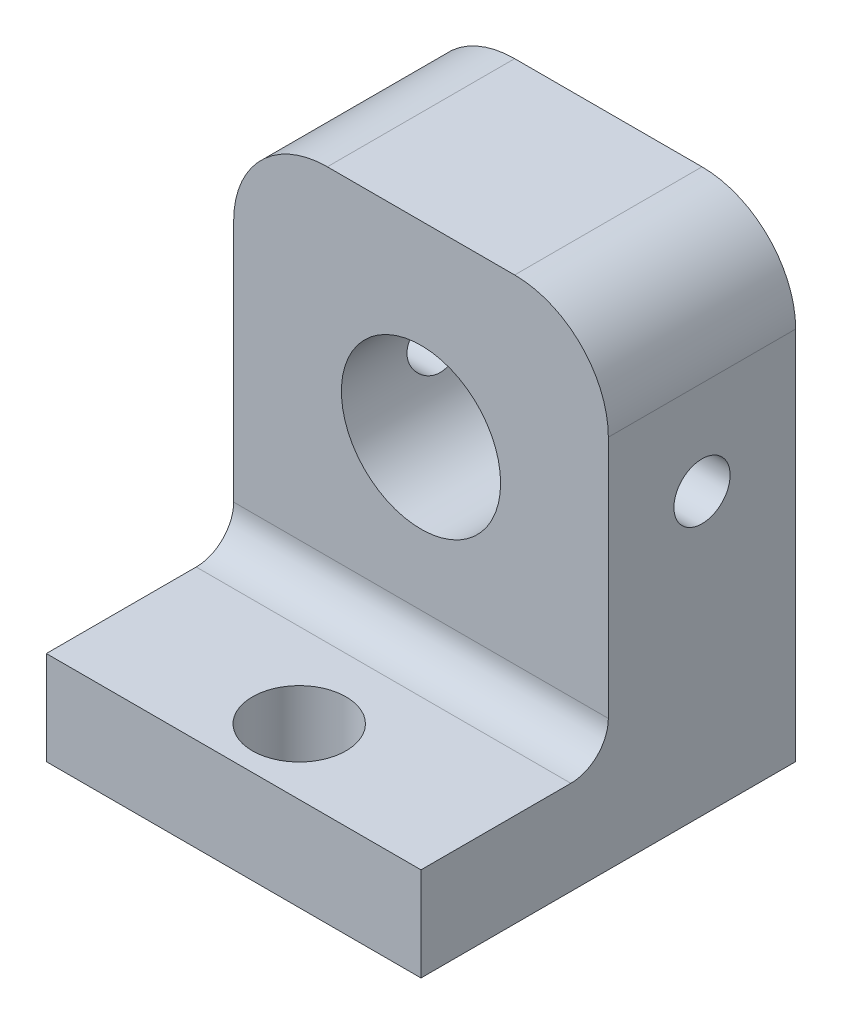
ISO-10303-21;
HEADER;
FILE_DESCRIPTION(('STEP AP214'),'2;1');
FILE_NAME('part.step','',(''),(''),'','','');
FILE_SCHEMA(('AUTOMOTIVE_DESIGN { 1 0 10303 214 1 1 1 1 }'));
ENDSEC;
DATA;
#1=APPLICATION_CONTEXT('core data for automotive mechanical design processes');
#2=APPLICATION_PROTOCOL_DEFINITION('international standard','automotive_design',2000,#1);
#3=PRODUCT_CONTEXT('',#1,'mechanical');
#4=PRODUCT('Part','Part','',(#3));
#5=PRODUCT_RELATED_PRODUCT_CATEGORY('part','',(#4));
#6=PRODUCT_DEFINITION_FORMATION('','',#4);
#7=PRODUCT_DEFINITION_CONTEXT('part definition',#1,'design');
#8=PRODUCT_DEFINITION('design','',#6,#7);
#9=PRODUCT_DEFINITION_SHAPE('','',#8);
#10=(LENGTH_UNIT() NAMED_UNIT(*) SI_UNIT(.MILLI.,.METRE.));
#11=(NAMED_UNIT(*) PLANE_ANGLE_UNIT() SI_UNIT($,.RADIAN.));
#12=(NAMED_UNIT(*) SI_UNIT($,.STERADIAN.) SOLID_ANGLE_UNIT());
#13=UNCERTAINTY_MEASURE_WITH_UNIT(LENGTH_MEASURE(1.E-05),#10,'distance_accuracy_value','');
#14=(GEOMETRIC_REPRESENTATION_CONTEXT(3) GLOBAL_UNCERTAINTY_ASSIGNED_CONTEXT((#13)) GLOBAL_UNIT_ASSIGNED_CONTEXT((#10,
#11,#12)) REPRESENTATION_CONTEXT('',''));
#15=CARTESIAN_POINT('',(0.,0.,0.));
#16=DIRECTION('',(0.,0.,1.));
#17=DIRECTION('',(1.,0.,0.));
#18=AXIS2_PLACEMENT_3D('',#15,#16,#17);
#19=CARTESIAN_POINT('',(0.,5.,0.));
#20=DIRECTION('',(0.,1.,0.));
#21=DIRECTION('',(0.,0.,1.));
#22=AXIS2_PLACEMENT_3D('',#19,#20,#21);
#23=PLANE('',#22);
#24=CARTESIAN_POINT('',(0.,5.,6.50000000000001));
#25=DIRECTION('',(0.,1.,0.));
#26=DIRECTION('',(0.,0.,1.));
#27=AXIS2_PLACEMENT_3D('',#24,#25,#26);
#28=CIRCLE('',#27,2.5);
#29=CARTESIAN_POINT('',(0.,5.,9.00000000000001));
#30=VERTEX_POINT('',#29);
#31=EDGE_CURVE('E124',#30,#30,#28,.T.);
#32=ORIENTED_EDGE('',*,*,#31,.F.);
#33=EDGE_LOOP('',(#32));
#34=FACE_BOUND('',#33,.T.);
#35=DIRECTION('',(0.,0.,-1.));
#36=VECTOR('',#35,1.);
#37=CARTESIAN_POINT('',(10.,5.,0.));
#38=LINE('',#37,#36);
#39=CARTESIAN_POINT('',(10.,5.,10.));
#40=VERTEX_POINT('',#39);
#41=CARTESIAN_POINT('',(10.,5.,2.));
#42=VERTEX_POINT('',#41);
#43=EDGE_CURVE('E128',#40,#42,#38,.T.);
#44=ORIENTED_EDGE('',*,*,#43,.T.);
#45=DIRECTION('',(-1.,0.,0.));
#46=VECTOR('',#45,1.);
#47=CARTESIAN_POINT('',(0.,5.,2.00000000000001));
#48=LINE('',#47,#46);
#49=CARTESIAN_POINT('',(-10.,5.,2.00000000000001));
#50=VERTEX_POINT('',#49);
#51=EDGE_CURVE('E123',#42,#50,#48,.T.);
#52=ORIENTED_EDGE('',*,*,#51,.T.);
#53=DIRECTION('',(0.,0.,-1.));
#54=VECTOR('',#53,1.);
#55=CARTESIAN_POINT('',(-10.,5.,0.));
#56=LINE('',#55,#54);
#57=CARTESIAN_POINT('',(-10.,5.,10.));
#58=VERTEX_POINT('',#57);
#59=EDGE_CURVE('E107',#58,#50,#56,.T.);
#60=ORIENTED_EDGE('',*,*,#59,.F.);
#61=DIRECTION('',(-1.,0.,0.));
#62=VECTOR('',#61,1.);
#63=CARTESIAN_POINT('',(0.,5.,10.));
#64=LINE('',#63,#62);
#65=EDGE_CURVE('E121',#40,#58,#64,.T.);
#66=ORIENTED_EDGE('',*,*,#65,.F.);
#67=EDGE_LOOP('',(#44,#52,#60,#66));
#68=FACE_BOUND('',#67,.T.);
#69=ADVANCED_FACE('F35',(#34,#68),#23,.T.);
#70=CARTESIAN_POINT('',(-10.,5.,0.));
#71=DIRECTION('',(-1.,0.,0.));
#72=DIRECTION('',(0.,0.,1.));
#73=AXIS2_PLACEMENT_3D('',#70,#71,#72);
#74=PLANE('',#73);
#75=CARTESIAN_POINT('',(-9.99999999999999,15.,-5.));
#76=DIRECTION('',(-1.,0.,0.));
#77=DIRECTION('',(0.,0.,1.));
#78=AXIS2_PLACEMENT_3D('',#75,#76,#77);
#79=CIRCLE('',#78,1.5);
#80=CARTESIAN_POINT('',(-9.99999999999999,15.,-3.5));
#81=VERTEX_POINT('',#80);
#82=EDGE_CURVE('E260',#81,#81,#79,.T.);
#83=ORIENTED_EDGE('',*,*,#82,.F.);
#84=EDGE_LOOP('',(#83));
#85=FACE_BOUND('',#84,.T.);
#86=DIRECTION('',(0.,-1.,0.));
#87=VECTOR('',#86,1.);
#88=CARTESIAN_POINT('',(-10.,25.,0.));
#89=LINE('',#88,#87);
#90=CARTESIAN_POINT('',(-10.,20.,0.));
#91=VERTEX_POINT('',#90);
#92=CARTESIAN_POINT('',(-10.,7.,0.));
#93=VERTEX_POINT('',#92);
#94=EDGE_CURVE('E137',#91,#93,#89,.T.);
#95=ORIENTED_EDGE('',*,*,#94,.F.);
#96=DIRECTION('',(0.,0.,-1.));
#97=VECTOR('',#96,1.);
#98=CARTESIAN_POINT('',(-10.,20.,0.));
#99=LINE('',#98,#97);
#100=CARTESIAN_POINT('',(-10.,20.,-9.99999999999999));
#101=VERTEX_POINT('',#100);
#102=EDGE_CURVE('E114',#91,#101,#99,.T.);
#103=ORIENTED_EDGE('',*,*,#102,.T.);
#104=DIRECTION('',(0.,-1.,0.));
#105=VECTOR('',#104,1.);
#106=CARTESIAN_POINT('',(-10.,5.,-9.99999999999999));
#107=LINE('',#106,#105);
#108=CARTESIAN_POINT('',(-10.,0.,-9.99999999999999));
#109=VERTEX_POINT('',#108);
#110=EDGE_CURVE('E130',#101,#109,#107,.T.);
#111=ORIENTED_EDGE('',*,*,#110,.T.);
#112=DIRECTION('',(0.,0.,-1.));
#113=VECTOR('',#112,1.);
#114=CARTESIAN_POINT('',(-10.,0.,0.));
#115=LINE('',#114,#113);
#116=CARTESIAN_POINT('',(-10.,0.,10.));
#117=VERTEX_POINT('',#116);
#118=EDGE_CURVE('E109',#117,#109,#115,.T.);
#119=ORIENTED_EDGE('',*,*,#118,.F.);
#120=DIRECTION('',(0.,-1.,0.));
#121=VECTOR('',#120,1.);
#122=CARTESIAN_POINT('',(-10.,5.,10.));
#123=LINE('',#122,#121);
#124=EDGE_CURVE('E104',#58,#117,#123,.T.);
#125=ORIENTED_EDGE('',*,*,#124,.F.);
#126=ORIENTED_EDGE('',*,*,#59,.T.);
#127=CARTESIAN_POINT('',(-10.,7.,2.00000000000001));
#128=DIRECTION('',(-1.,0.,0.));
#129=DIRECTION('',(0.,0.,1.));
#130=AXIS2_PLACEMENT_3D('',#127,#128,#129);
#131=CIRCLE('',#130,2.);
#132=EDGE_CURVE('E43',#50,#93,#131,.F.);
#133=ORIENTED_EDGE('',*,*,#132,.T.);
#134=EDGE_LOOP('',(#95,#103,#111,#119,#125,#126,#133));
#135=FACE_BOUND('',#134,.T.);
#136=ADVANCED_FACE('F106',(#85,#135),#74,.T.);
#137=CARTESIAN_POINT('',(0.,5.,10.));
#138=DIRECTION('',(0.,0.,1.));
#139=DIRECTION('',(1.,0.,0.));
#140=AXIS2_PLACEMENT_3D('',#137,#138,#139);
#141=PLANE('',#140);
#142=DIRECTION('',(-1.,0.,0.));
#143=VECTOR('',#142,1.);
#144=CARTESIAN_POINT('',(0.,0.,10.));
#145=LINE('',#144,#143);
#146=CARTESIAN_POINT('',(10.,0.,10.));
#147=VERTEX_POINT('',#146);
#148=EDGE_CURVE('E139',#147,#117,#145,.T.);
#149=ORIENTED_EDGE('',*,*,#148,.F.);
#150=DIRECTION('',(0.,-1.,0.));
#151=VECTOR('',#150,1.);
#152=CARTESIAN_POINT('',(10.,5.,10.));
#153=LINE('',#152,#151);
#154=EDGE_CURVE('E115',#40,#147,#153,.T.);
#155=ORIENTED_EDGE('',*,*,#154,.F.);
#156=ORIENTED_EDGE('',*,*,#65,.T.);
#157=ORIENTED_EDGE('',*,*,#124,.T.);
#158=EDGE_LOOP('',(#149,#155,#156,#157));
#159=FACE_BOUND('',#158,.T.);
#160=ADVANCED_FACE('F126',(#159),#141,.T.);
#161=CARTESIAN_POINT('',(10.,5.,0.));
#162=DIRECTION('',(-1.,0.,0.));
#163=DIRECTION('',(0.,0.,1.));
#164=AXIS2_PLACEMENT_3D('',#161,#162,#163);
#165=PLANE('',#164);
#166=CARTESIAN_POINT('',(10.,15.,-5.));
#167=DIRECTION('',(1.,0.,0.));
#168=DIRECTION('',(0.,0.,-1.));
#169=AXIS2_PLACEMENT_3D('',#166,#167,#168);
#170=CIRCLE('',#169,1.5);
#171=CARTESIAN_POINT('',(10.,15.,-6.5));
#172=VERTEX_POINT('',#171);
#173=EDGE_CURVE('E160',#172,#172,#170,.T.);
#174=ORIENTED_EDGE('',*,*,#173,.F.);
#175=EDGE_LOOP('',(#174));
#176=FACE_BOUND('',#175,.T.);
#177=DIRECTION('',(0.,-1.,0.));
#178=VECTOR('',#177,1.);
#179=CARTESIAN_POINT('',(10.,5.,-10.));
#180=LINE('',#179,#178);
#181=CARTESIAN_POINT('',(10.,20.,-10.));
#182=VERTEX_POINT('',#181);
#183=CARTESIAN_POINT('',(10.,0.,-10.));
#184=VERTEX_POINT('',#183);
#185=EDGE_CURVE('E148',#182,#184,#180,.T.);
#186=ORIENTED_EDGE('',*,*,#185,.F.);
#187=DIRECTION('',(0.,0.,-1.));
#188=VECTOR('',#187,1.);
#189=CARTESIAN_POINT('',(10.,20.,0.));
#190=LINE('',#189,#188);
#191=CARTESIAN_POINT('',(10.,20.,0.));
#192=VERTEX_POINT('',#191);
#193=EDGE_CURVE('E224',#182,#192,#190,.F.);
#194=ORIENTED_EDGE('',*,*,#193,.T.);
#195=DIRECTION('',(0.,-1.,0.));
#196=VECTOR('',#195,1.);
#197=CARTESIAN_POINT('',(10.,25.,0.));
#198=LINE('',#197,#196);
#199=CARTESIAN_POINT('',(10.,7.,0.));
#200=VERTEX_POINT('',#199);
#201=EDGE_CURVE('E240',#192,#200,#198,.T.);
#202=ORIENTED_EDGE('',*,*,#201,.T.);
#203=CARTESIAN_POINT('',(10.,7.,2.));
#204=DIRECTION('',(-1.,0.,0.));
#205=DIRECTION('',(0.,0.,1.));
#206=AXIS2_PLACEMENT_3D('',#203,#204,#205);
#207=CIRCLE('',#206,2.);
#208=EDGE_CURVE('E11',#200,#42,#207,.T.);
#209=ORIENTED_EDGE('',*,*,#208,.T.);
#210=ORIENTED_EDGE('',*,*,#43,.F.);
#211=ORIENTED_EDGE('',*,*,#154,.T.);
#212=DIRECTION('',(0.,0.,-1.));
#213=VECTOR('',#212,1.);
#214=CARTESIAN_POINT('',(10.,0.,0.));
#215=LINE('',#214,#213);
#216=EDGE_CURVE('E141',#147,#184,#215,.T.);
#217=ORIENTED_EDGE('',*,*,#216,.T.);
#218=EDGE_LOOP('',(#186,#194,#202,#209,#210,#211,#217));
#219=FACE_BOUND('',#218,.T.);
#220=ADVANCED_FACE('F206',(#176,#219),#165,.F.);
#221=CARTESIAN_POINT('',(0.,5.,6.50000000000001));
#222=DIRECTION('',(0.,-1.,0.));
#223=DIRECTION('',(0.,0.,-1.));
#224=AXIS2_PLACEMENT_3D('',#221,#222,#223);
#225=CYLINDRICAL_SURFACE('',#224,2.5);
#226=ORIENTED_EDGE('',*,*,#31,.T.);
#227=EDGE_LOOP('',(#226));
#228=FACE_BOUND('',#227,.T.);
#229=CARTESIAN_POINT('',(0.,0.,6.50000000000001));
#230=DIRECTION('',(0.,1.,0.));
#231=DIRECTION('',(0.,0.,1.));
#232=AXIS2_PLACEMENT_3D('',#229,#230,#231);
#233=CIRCLE('',#232,2.5);
#234=CARTESIAN_POINT('',(0.,0.,9.00000000000001));
#235=VERTEX_POINT('',#234);
#236=EDGE_CURVE('E134',#235,#235,#233,.T.);
#237=ORIENTED_EDGE('',*,*,#236,.F.);
#238=EDGE_LOOP('',(#237));
#239=FACE_BOUND('',#238,.T.);
#240=ADVANCED_FACE('F204',(#228,#239),#225,.F.);
#241=CARTESIAN_POINT('',(0.,5.,-9.99999999999999));
#242=DIRECTION('',(0.,0.,1.));
#243=DIRECTION('',(1.,0.,0.));
#244=AXIS2_PLACEMENT_3D('',#241,#242,#243);
#245=PLANE('',#244);
#246=CARTESIAN_POINT('',(0.,15.,-9.99999999999999));
#247=DIRECTION('',(0.,0.,1.));
#248=DIRECTION('',(1.,0.,0.));
#249=AXIS2_PLACEMENT_3D('',#246,#247,#248);
#250=CIRCLE('',#249,4.25);
#251=CARTESIAN_POINT('',(4.25,15.,-9.99999999999999));
#252=VERTEX_POINT('',#251);
#253=EDGE_CURVE('E254',#252,#252,#250,.T.);
#254=ORIENTED_EDGE('',*,*,#253,.T.);
#255=EDGE_LOOP('',(#254));
#256=FACE_BOUND('',#255,.T.);
#257=ORIENTED_EDGE('',*,*,#110,.F.);
#258=CARTESIAN_POINT('',(-5.,20.,-9.99999999999999));
#259=DIRECTION('',(0.,0.,1.));
#260=DIRECTION('',(1.,0.,0.));
#261=AXIS2_PLACEMENT_3D('',#258,#259,#260);
#262=CIRCLE('',#261,5.);
#263=CARTESIAN_POINT('',(-5.,25.,-9.99999999999999));
#264=VERTEX_POINT('',#263);
#265=EDGE_CURVE('E279',#101,#264,#262,.F.);
#266=ORIENTED_EDGE('',*,*,#265,.T.);
#267=DIRECTION('',(-1.,0.,0.));
#268=VECTOR('',#267,1.);
#269=CARTESIAN_POINT('',(0.,25.,-9.99999999999999));
#270=LINE('',#269,#268);
#271=CARTESIAN_POINT('',(5.,25.,-10.));
#272=VERTEX_POINT('',#271);
#273=EDGE_CURVE('E242',#272,#264,#270,.T.);
#274=ORIENTED_EDGE('',*,*,#273,.F.);
#275=CARTESIAN_POINT('',(5.,20.,-10.));
#276=DIRECTION('',(0.,0.,1.));
#277=DIRECTION('',(1.,0.,0.));
#278=AXIS2_PLACEMENT_3D('',#275,#276,#277);
#279=CIRCLE('',#278,5.);
#280=EDGE_CURVE('E285',#272,#182,#279,.F.);
#281=ORIENTED_EDGE('',*,*,#280,.T.);
#282=ORIENTED_EDGE('',*,*,#185,.T.);
#283=DIRECTION('',(-1.,0.,0.));
#284=VECTOR('',#283,1.);
#285=CARTESIAN_POINT('',(0.,0.,-9.99999999999999));
#286=LINE('',#285,#284);
#287=EDGE_CURVE('E144',#184,#109,#286,.T.);
#288=ORIENTED_EDGE('',*,*,#287,.T.);
#289=EDGE_LOOP('',(#257,#266,#274,#281,#282,#288));
#290=FACE_BOUND('',#289,.T.);
#291=ADVANCED_FACE('F200',(#256,#290),#245,.F.);
#292=CARTESIAN_POINT('',(0.,0.,0.));
#293=DIRECTION('',(0.,1.,0.));
#294=DIRECTION('',(0.,0.,1.));
#295=AXIS2_PLACEMENT_3D('',#292,#293,#294);
#296=PLANE('',#295);
#297=ORIENTED_EDGE('',*,*,#287,.F.);
#298=ORIENTED_EDGE('',*,*,#216,.F.);
#299=ORIENTED_EDGE('',*,*,#148,.T.);
#300=ORIENTED_EDGE('',*,*,#118,.T.);
#301=EDGE_LOOP('',(#297,#298,#299,#300));
#302=FACE_BOUND('',#301,.T.);
#303=ORIENTED_EDGE('',*,*,#236,.T.);
#304=EDGE_LOOP('',(#303));
#305=FACE_BOUND('',#304,.T.);
#306=ADVANCED_FACE('F197',(#302,#305),#296,.F.);
#307=CARTESIAN_POINT('',(0.,25.,0.));
#308=DIRECTION('',(0.,0.,-1.));
#309=DIRECTION('',(-1.,0.,0.));
#310=AXIS2_PLACEMENT_3D('',#307,#308,#309);
#311=PLANE('',#310);
#312=CARTESIAN_POINT('',(0.,15.,0.));
#313=DIRECTION('',(0.,0.,1.));
#314=DIRECTION('',(1.,0.,0.));
#315=AXIS2_PLACEMENT_3D('',#312,#313,#314);
#316=CIRCLE('',#315,4.25);
#317=CARTESIAN_POINT('',(4.25,15.,0.));
#318=VERTEX_POINT('',#317);
#319=EDGE_CURVE('E257',#318,#318,#316,.T.);
#320=ORIENTED_EDGE('',*,*,#319,.F.);
#321=EDGE_LOOP('',(#320));
#322=FACE_BOUND('',#321,.T.);
#323=ORIENTED_EDGE('',*,*,#94,.T.);
#324=DIRECTION('',(-1.,0.,0.));
#325=VECTOR('',#324,1.);
#326=CARTESIAN_POINT('',(0.,7.,0.));
#327=LINE('',#326,#325);
#328=EDGE_CURVE('E50',#93,#200,#327,.F.);
#329=ORIENTED_EDGE('',*,*,#328,.T.);
#330=ORIENTED_EDGE('',*,*,#201,.F.);
#331=CARTESIAN_POINT('',(5.,20.,0.));
#332=DIRECTION('',(0.,0.,-1.));
#333=DIRECTION('',(-1.,0.,0.));
#334=AXIS2_PLACEMENT_3D('',#331,#332,#333);
#335=CIRCLE('',#334,5.);
#336=CARTESIAN_POINT('',(5.,25.,0.));
#337=VERTEX_POINT('',#336);
#338=EDGE_CURVE('E223',#192,#337,#335,.F.);
#339=ORIENTED_EDGE('',*,*,#338,.T.);
#340=DIRECTION('',(1.,0.,0.));
#341=VECTOR('',#340,1.);
#342=CARTESIAN_POINT('',(0.,25.,0.));
#343=LINE('',#342,#341);
#344=CARTESIAN_POINT('',(-5.,25.,0.));
#345=VERTEX_POINT('',#344);
#346=EDGE_CURVE('E246',#345,#337,#343,.T.);
#347=ORIENTED_EDGE('',*,*,#346,.F.);
#348=CARTESIAN_POINT('',(-5.,20.,0.));
#349=DIRECTION('',(0.,0.,-1.));
#350=DIRECTION('',(-1.,0.,0.));
#351=AXIS2_PLACEMENT_3D('',#348,#349,#350);
#352=CIRCLE('',#351,5.);
#353=EDGE_CURVE('E229',#345,#91,#352,.F.);
#354=ORIENTED_EDGE('',*,*,#353,.T.);
#355=EDGE_LOOP('',(#323,#329,#330,#339,#347,#354));
#356=FACE_BOUND('',#355,.T.);
#357=ADVANCED_FACE('F196',(#322,#356),#311,.F.);
#358=CARTESIAN_POINT('',(0.,25.,0.));
#359=DIRECTION('',(0.,1.,0.));
#360=DIRECTION('',(0.,0.,1.));
#361=AXIS2_PLACEMENT_3D('',#358,#359,#360);
#362=PLANE('',#361);
#363=ORIENTED_EDGE('',*,*,#273,.T.);
#364=DIRECTION('',(0.,0.,-1.));
#365=VECTOR('',#364,1.);
#366=CARTESIAN_POINT('',(-5.,25.,0.));
#367=LINE('',#366,#365);
#368=EDGE_CURVE('E230',#264,#345,#367,.F.);
#369=ORIENTED_EDGE('',*,*,#368,.T.);
#370=ORIENTED_EDGE('',*,*,#346,.T.);
#371=DIRECTION('',(0.,0.,-1.));
#372=VECTOR('',#371,1.);
#373=CARTESIAN_POINT('',(5.,25.,-10.));
#374=LINE('',#373,#372);
#375=EDGE_CURVE('E226',#337,#272,#374,.T.);
#376=ORIENTED_EDGE('',*,*,#375,.T.);
#377=EDGE_LOOP('',(#363,#369,#370,#376));
#378=FACE_BOUND('',#377,.T.);
#379=ADVANCED_FACE('F270',(#378),#362,.T.);
#380=CARTESIAN_POINT('',(0.,15.,-88.));
#381=DIRECTION('',(0.,0.,1.));
#382=DIRECTION('',(1.,0.,0.));
#383=AXIS2_PLACEMENT_3D('',#380,#381,#382);
#384=CYLINDRICAL_SURFACE('',#383,4.25);
#385=CARTESIAN_POINT('',(4.25,15.,-6.49999999999999));
#386=CARTESIAN_POINT('',(4.2500010209157,15.0815655083667,-6.50000143944535));
#387=CARTESIAN_POINT('',(4.24763079702054,15.1631207396293,-6.49332577446252));
#388=CARTESIAN_POINT('',(4.23841044575562,15.323812547744,-6.46689313191938));
#389=CARTESIAN_POINT('',(4.2315603770681,15.4029491562638,-6.44713632571116));
#390=CARTESIAN_POINT('',(4.2141205688639,15.5564638689952,-6.39531449292629));
#391=CARTESIAN_POINT('',(4.20353753046498,15.6308502197219,-6.36327151255959));
#392=CARTESIAN_POINT('',(4.17969988413846,15.7731905397872,-6.28789229743801));
#393=CARTESIAN_POINT('',(4.16644465546129,15.8411430091355,-6.24455343796499));
#394=CARTESIAN_POINT('',(4.13807832016637,15.9712872677489,-6.14607496486553));
#395=CARTESIAN_POINT('',(4.12291896125755,16.0331994160495,-6.09057979490176));
#396=CARTESIAN_POINT('',(4.09270521060981,16.1470573280697,-5.97011924449603));
#397=CARTESIAN_POINT('',(4.07765084685791,16.1990005255228,-5.90515143310439));
#398=CARTESIAN_POINT('',(4.04880698686655,16.2931242772022,-5.76497468097734));
#399=CARTESIAN_POINT('',(4.03507546976457,16.3349270075802,-5.68949894382118));
#400=CARTESIAN_POINT('',(4.01117354628646,16.4051234982238,-5.53202601709707));
#401=CARTESIAN_POINT('',(4.0010019017598,16.4335219218092,-5.45003110714739));
#402=CARTESIAN_POINT('',(3.9858829929351,16.4750292626899,-5.28504742524595));
#403=CARTESIAN_POINT('',(3.98075571416019,16.4886668941198,-5.20220868575249));
#404=CARTESIAN_POINT('',(3.97577601517782,16.5019188071328,-5.03527219196318));
#405=CARTESIAN_POINT('',(3.97592172401636,16.5015380626955,-4.95117489481368));
#406=CARTESIAN_POINT('',(3.98131493672348,16.487171647383,-4.78876227923844));
#407=CARTESIAN_POINT('',(3.98629652758993,16.4738950639563,-4.71037382789625));
#408=CARTESIAN_POINT('',(4.00036197260984,16.4352776734831,-4.55701851152451));
#409=CARTESIAN_POINT('',(4.00944637437166,16.4099352559671,-4.48205210471155));
#410=CARTESIAN_POINT('',(4.03086961718048,16.3474763669417,-4.33613441236969));
#411=CARTESIAN_POINT('',(4.04326253509493,16.3101619580702,-4.26527613813148));
#412=CARTESIAN_POINT('',(4.06988590478,16.2249558676346,-4.13061114374695));
#413=CARTESIAN_POINT('',(4.0841169363794,16.1770608450389,-4.06680666054036));
#414=CARTESIAN_POINT('',(4.11383840224644,16.0687213955098,-3.94410211573714));
#415=CARTESIAN_POINT('',(4.12935360736949,16.0077033472796,-3.88571339048548));
#416=CARTESIAN_POINT('',(4.15916674047781,15.8765552448598,-3.77985529588603));
#417=CARTESIAN_POINT('',(4.17346452155981,15.8064240935884,-3.73238724313357));
#418=CARTESIAN_POINT('',(4.19946112552831,15.6578561927707,-3.64923840720676));
#419=CARTESIAN_POINT('',(4.2111258238281,15.5793279072425,-3.61370976381837));
#420=CARTESIAN_POINT('',(4.23029207791539,15.4168968768017,-3.55653120313297));
#421=CARTESIAN_POINT('',(4.23779526295093,15.3329962495513,-3.53487585387367));
#422=CARTESIAN_POINT('',(4.24751560494482,15.1665195024488,-3.50699956687643));
#423=CARTESIAN_POINT('',(4.24996881305308,15.084072537849,-3.50008881463701));
#424=CARTESIAN_POINT('',(4.25003056815402,14.9191710934224,-3.49991293869687));
#425=CARTESIAN_POINT('',(4.24764004701629,14.8367166180923,-3.50664519026226));
#426=CARTESIAN_POINT('',(4.23843896402726,14.6770018497132,-3.53302755425178));
#427=CARTESIAN_POINT('',(4.2317778102469,14.5996599961407,-3.55224129201919));
#428=CARTESIAN_POINT('',(4.21485447662064,14.449338945805,-3.60248244929079));
#429=CARTESIAN_POINT('',(4.2045918300867,14.3763603158715,-3.63351139987629));
#430=CARTESIAN_POINT('',(4.18113823249899,14.2345624874119,-3.70745316384237));
#431=CARTESIAN_POINT('',(4.16787357328707,14.1659161338648,-3.75067337085768));
#432=CARTESIAN_POINT('',(4.13990428237041,14.0366336982178,-3.84741636920994));
#433=CARTESIAN_POINT('',(4.12519916677669,13.9760003240774,-3.90094262850451));
#434=CARTESIAN_POINT('',(4.09504516039956,13.8612254525735,-4.02001323560803));
#435=CARTESIAN_POINT('',(4.0795967484747,13.8075754788489,-4.08603269288312));
#436=CARTESIAN_POINT('',(4.050451474741,13.7120382833121,-4.22645905200557));
#437=CARTESIAN_POINT('',(4.03675468400403,13.6701515387094,-4.30086629395622));
#438=CARTESIAN_POINT('',(4.01276844860528,13.5994313969781,-4.4562247580116));
#439=CARTESIAN_POINT('',(4.00248050035801,13.5706037304932,-4.53717883469946));
#440=CARTESIAN_POINT('',(3.98669663677319,13.5271473724767,-4.70324802962323));
#441=CARTESIAN_POINT('',(3.98119820675466,13.5125112293929,-4.78836093949024));
#442=CARTESIAN_POINT('',(3.97592446271836,13.498475672914,-4.95507571865943));
#443=CARTESIAN_POINT('',(3.97583895136912,13.4982504090341,-5.03659893285742));
#444=CARTESIAN_POINT('',(3.98062071938137,13.5109721823524,-5.19845529984475));
#445=CARTESIAN_POINT('',(3.98548763101594,13.5239182415546,-5.2787885405426));
#446=CARTESIAN_POINT('',(3.99938188223679,13.5620022319411,-5.43405368378034));
#447=CARTESIAN_POINT('',(4.00830695183632,13.5868412199511,-5.5090688109465));
#448=CARTESIAN_POINT('',(4.02926366752764,13.6477549144838,-5.65391934979862));
#449=CARTESIAN_POINT('',(4.04129605143985,13.6838322899406,-5.72375352621022));
#450=CARTESIAN_POINT('',(4.06782868650947,13.7682077994862,-5.85988604831732));
#451=CARTESIAN_POINT('',(4.08241946444022,13.8170080196561,-5.92585539643861));
#452=CARTESIAN_POINT('',(4.11207835247002,13.9246285183541,-6.04893433302365));
#453=CARTESIAN_POINT('',(4.12714660409913,13.9834517909086,-6.10604126439113));
#454=CARTESIAN_POINT('',(4.15688911811243,14.1126679135724,-6.21241802120559));
#455=CARTESIAN_POINT('',(4.17151395756386,14.1834664587041,-6.26121080900395));
#456=CARTESIAN_POINT('',(4.19797905376782,14.3327590518131,-6.34616589279597));
#457=CARTESIAN_POINT('',(4.20981961499931,14.4112522569978,-6.38232957007517));
#458=CARTESIAN_POINT('',(4.22931721412351,14.573380915312,-6.4406175423347));
#459=CARTESIAN_POINT('',(4.23699362671968,14.6569905039307,-6.46280693508599));
#460=CARTESIAN_POINT('',(4.24733355773892,14.8270712862147,-6.49249470234612));
#461=CARTESIAN_POINT('',(4.24999891784007,14.9135414166702,-6.49999847420301));
#462=CARTESIAN_POINT('',(4.25,15.,-6.49999999999999));
#463=B_SPLINE_CURVE_WITH_KNOTS('',3,(#385,#386,#387,#388,#389,#390,#391,#392,#393,#394,#395,
#396,#397,#398,#399,#400,#401,#402,#403,#404,#405,#406,#407,#408,#409,#410,#411,#412,#413,#414,
#415,#416,#417,#418,#419,#420,#421,#422,#423,#424,#425,#426,#427,#428,#429,#430,#431,#432,#433,
#434,#435,#436,#437,#438,#439,#440,#441,#442,#443,#444,#445,#446,#447,#448,#449,#450,#451,#452,
#453,#454,#455,#456,#457,#458,#459,#460,#461,#462),.UNSPECIFIED.,.T.,.F.,(4,2,2,2,2,2,2,2,2,2,2,
2,2,2,2,2,2,2,2,2,2,2,2,2,2,2,2,2,2,2,2,2,2,2,2,2,2,2,4),(0.,0.244378011015889,
0.488752820946187,0.732691163485118,0.976686238313039,1.22909954192451,1.4815777363669,
1.74237029797326,2.00307206360573,2.25409069161506,2.5050202544238,2.74289041367082,
2.98079233119384,3.22284994005456,3.46498409277591,3.72140166887643,3.97785014247673,
4.23745243599866,4.49695302237794,4.74401979264809,4.99103903504468,5.22985573929487,
5.46870340128574,5.71421460975224,5.95980857688844,6.21798068295959,6.47616326101999,
6.73445902643867,6.99261909477786,7.23597058627499,7.47930400977472,7.716818677586,
7.95438979432423,8.20332669356905,8.45233808454077,8.7127219459576,8.97307731944663,
9.23221070401172,9.49124883241259),.UNSPECIFIED.);
#464=CARTESIAN_POINT('',(4.25,15.,-6.49999999999999));
#465=VERTEX_POINT('',#464);
#466=EDGE_CURVE('E159',#465,#465,#463,.T.);
#467=ORIENTED_EDGE('',*,*,#466,.T.);
#468=EDGE_LOOP('',(#467));
#469=FACE_BOUND('',#468,.T.);
#470=CARTESIAN_POINT('',(-4.25,15.,-6.5));
#471=CARTESIAN_POINT('',(-4.2500010209157,14.9184344916333,-6.50000143944536));
#472=CARTESIAN_POINT('',(-4.24763079702054,14.8368792603707,-6.49332577446252));
#473=CARTESIAN_POINT('',(-4.23841044575562,14.676187452256,-6.46689313191938));
#474=CARTESIAN_POINT('',(-4.2315603770681,14.5970508437362,-6.44713632571116));
#475=CARTESIAN_POINT('',(-4.2141205688639,14.4435361310048,-6.39531449292629));
#476=CARTESIAN_POINT('',(-4.20353753046498,14.3691497802781,-6.36327151255959));
#477=CARTESIAN_POINT('',(-4.17969988413846,14.2268094602128,-6.28789229743801));
#478=CARTESIAN_POINT('',(-4.16644465546129,14.1588569908645,-6.24455343796499));
#479=CARTESIAN_POINT('',(-4.13807832016637,14.0287127322511,-6.14607496486554));
#480=CARTESIAN_POINT('',(-4.12291896125755,13.9668005839505,-6.09057979490176));
#481=CARTESIAN_POINT('',(-4.09270521060981,13.8529426719303,-5.97011924449603));
#482=CARTESIAN_POINT('',(-4.07765084685791,13.8009994744772,-5.90515143310439));
#483=CARTESIAN_POINT('',(-4.04880698686655,13.7068757227978,-5.76497468097734));
#484=CARTESIAN_POINT('',(-4.03507546976457,13.6650729924198,-5.68949894382118));
#485=CARTESIAN_POINT('',(-4.01117354628646,13.5948765017762,-5.53202601709707));
#486=CARTESIAN_POINT('',(-4.0010019017598,13.5664780781908,-5.4500311071474));
#487=CARTESIAN_POINT('',(-3.9858829929351,13.5249707373101,-5.28504742524595));
#488=CARTESIAN_POINT('',(-3.98075571416019,13.5113331058802,-5.20220868575249));
#489=CARTESIAN_POINT('',(-3.97577601517782,13.4980811928672,-5.03527219196318));
#490=CARTESIAN_POINT('',(-3.97592172401636,13.4984619373045,-4.95117489481369));
#491=CARTESIAN_POINT('',(-3.98131493672348,13.512828352617,-4.78876227923844));
#492=CARTESIAN_POINT('',(-3.98629652758993,13.5261049360437,-4.71037382789625));
#493=CARTESIAN_POINT('',(-4.00036197260984,13.5647223265169,-4.55701851152451));
#494=CARTESIAN_POINT('',(-4.00944637437166,13.5900647440329,-4.48205210471155));
#495=CARTESIAN_POINT('',(-4.03086961718048,13.6525236330583,-4.33613441236969));
#496=CARTESIAN_POINT('',(-4.04326253509493,13.6898380419298,-4.26527613813148));
#497=CARTESIAN_POINT('',(-4.06988590478,13.7750441323654,-4.13061114374695));
#498=CARTESIAN_POINT('',(-4.0841169363794,13.8229391549611,-4.06680666054036));
#499=CARTESIAN_POINT('',(-4.11383840224644,13.9312786044902,-3.94410211573714));
#500=CARTESIAN_POINT('',(-4.12935360736949,13.9922966527204,-3.88571339048548));
#501=CARTESIAN_POINT('',(-4.15916674047781,14.1234447551402,-3.77985529588603));
#502=CARTESIAN_POINT('',(-4.17346452155981,14.1935759064116,-3.73238724313357));
#503=CARTESIAN_POINT('',(-4.19946112552831,14.3421438072293,-3.64923840720676));
#504=CARTESIAN_POINT('',(-4.2111258238281,14.4206720927575,-3.61370976381837));
#505=CARTESIAN_POINT('',(-4.23029207791539,14.5831031231983,-3.55653120313297));
#506=CARTESIAN_POINT('',(-4.23779526295093,14.6670037504487,-3.53487585387367));
#507=CARTESIAN_POINT('',(-4.24751560494482,14.8334804975512,-3.50699956687643));
#508=CARTESIAN_POINT('',(-4.24996881305308,14.915927462151,-3.50008881463701));
#509=CARTESIAN_POINT('',(-4.25003056815402,15.0808289065776,-3.49991293869687));
#510=CARTESIAN_POINT('',(-4.24764004701629,15.1632833819077,-3.50664519026226));
#511=CARTESIAN_POINT('',(-4.23843896402726,15.3229981502868,-3.53302755425178));
#512=CARTESIAN_POINT('',(-4.2317778102469,15.4003400038593,-3.55224129201919));
#513=CARTESIAN_POINT('',(-4.21485447662064,15.550661054195,-3.60248244929079));
#514=CARTESIAN_POINT('',(-4.2045918300867,15.6236396841285,-3.63351139987628));
#515=CARTESIAN_POINT('',(-4.18113823249899,15.7654375125881,-3.70745316384237));
#516=CARTESIAN_POINT('',(-4.16787357328707,15.8340838661352,-3.75067337085768));
#517=CARTESIAN_POINT('',(-4.13990428237041,15.9633663017822,-3.84741636920994));
#518=CARTESIAN_POINT('',(-4.12519916677669,16.0239996759226,-3.9009426285045));
#519=CARTESIAN_POINT('',(-4.09504516039956,16.1387745474265,-4.02001323560803));
#520=CARTESIAN_POINT('',(-4.07959674847471,16.1924245211511,-4.08603269288312));
#521=CARTESIAN_POINT('',(-4.05045147474101,16.2879617166879,-4.22645905200556));
#522=CARTESIAN_POINT('',(-4.03675468400403,16.3298484612906,-4.30086629395622));
#523=CARTESIAN_POINT('',(-4.01276844860528,16.4005686030219,-4.45622475801159));
#524=CARTESIAN_POINT('',(-4.00248050035801,16.4293962695068,-4.53717883469946));
#525=CARTESIAN_POINT('',(-3.98669663677319,16.4728526275233,-4.70324802962323));
#526=CARTESIAN_POINT('',(-3.98119820675466,16.4874887706071,-4.78836093949023));
#527=CARTESIAN_POINT('',(-3.97592446271836,16.501524327086,-4.95507571865943));
#528=CARTESIAN_POINT('',(-3.97583895136912,16.5017495909659,-5.03659893285741));
#529=CARTESIAN_POINT('',(-3.98062071938137,16.4890278176476,-5.19845529984475));
#530=CARTESIAN_POINT('',(-3.98548763101594,16.4760817584454,-5.2787885405426));
#531=CARTESIAN_POINT('',(-3.99938188223679,16.4379977680589,-5.43405368378034));
#532=CARTESIAN_POINT('',(-4.00830695183632,16.4131587800489,-5.5090688109465));
#533=CARTESIAN_POINT('',(-4.02926366752764,16.3522450855162,-5.65391934979862));
#534=CARTESIAN_POINT('',(-4.04129605143985,16.3161677100594,-5.72375352621022));
#535=CARTESIAN_POINT('',(-4.06782868650947,16.2317922005138,-5.85988604831732));
#536=CARTESIAN_POINT('',(-4.08241946444022,16.182991980344,-5.9258553964386));
#537=CARTESIAN_POINT('',(-4.11207835247002,16.0753714816459,-6.04893433302365));
#538=CARTESIAN_POINT('',(-4.12714660409913,16.0165482090914,-6.10604126439112));
#539=CARTESIAN_POINT('',(-4.15688911811243,15.8873320864276,-6.21241802120559));
#540=CARTESIAN_POINT('',(-4.17151395756386,15.8165335412959,-6.26121080900395));
#541=CARTESIAN_POINT('',(-4.19797905376782,15.6672409481869,-6.34616589279597));
#542=CARTESIAN_POINT('',(-4.20981961499931,15.5887477430022,-6.38232957007516));
#543=CARTESIAN_POINT('',(-4.22931721412351,15.426619084688,-6.4406175423347));
#544=CARTESIAN_POINT('',(-4.23699362671968,15.3430094960693,-6.46280693508599));
#545=CARTESIAN_POINT('',(-4.24733355773892,15.1729287137853,-6.49249470234612));
#546=CARTESIAN_POINT('',(-4.24999891784007,15.0864585833298,-6.49999847420301));
#547=CARTESIAN_POINT('',(-4.25,15.,-6.5));
#548=B_SPLINE_CURVE_WITH_KNOTS('',3,(#470,#471,#472,#473,#474,#475,#476,#477,#478,#479,#480,
#481,#482,#483,#484,#485,#486,#487,#488,#489,#490,#491,#492,#493,#494,#495,#496,#497,#498,#499,
#500,#501,#502,#503,#504,#505,#506,#507,#508,#509,#510,#511,#512,#513,#514,#515,#516,#517,#518,
#519,#520,#521,#522,#523,#524,#525,#526,#527,#528,#529,#530,#531,#532,#533,#534,#535,#536,#537,
#538,#539,#540,#541,#542,#543,#544,#545,#546,#547),.UNSPECIFIED.,.T.,.F.,(4,2,2,2,2,2,2,2,2,2,2,
2,2,2,2,2,2,2,2,2,2,2,2,2,2,2,2,2,2,2,2,2,2,2,2,2,2,2,4),(0.,0.244378011015888,
0.488752820946185,0.73269116348512,0.976686238313035,1.22909954192451,1.48157773636689,
1.74237029797326,2.00307206360572,2.25409069161505,2.50502025442379,2.74289041367082,
2.98079233119384,3.22284994005456,3.46498409277591,3.72140166887643,3.97785014247672,
4.23745243599866,4.49695302237793,4.74401979264808,4.99103903504467,5.22985573929486,
5.46870340128574,5.71421460975224,5.95980857688843,6.21798068295958,6.47616326101998,
6.73445902643867,6.99261909477785,7.23597058627498,7.47930400977472,7.716818677586,
7.95438979432423,8.20332669356905,8.45233808454076,8.7127219459576,8.97307731944662,
9.23221070401172,9.49124883241259),.UNSPECIFIED.);
#549=CARTESIAN_POINT('',(-4.25,15.,-6.5));
#550=VERTEX_POINT('',#549);
#551=EDGE_CURVE('E151',#550,#550,#548,.T.);
#552=ORIENTED_EDGE('',*,*,#551,.T.);
#553=EDGE_LOOP('',(#552));
#554=FACE_BOUND('',#553,.T.);
#555=ORIENTED_EDGE('',*,*,#319,.T.);
#556=EDGE_LOOP('',(#555));
#557=FACE_BOUND('',#556,.T.);
#558=ORIENTED_EDGE('',*,*,#253,.F.);
#559=EDGE_LOOP('',(#558));
#560=FACE_BOUND('',#559,.T.);
#561=ADVANCED_FACE('F165',(#469,#554,#557,#560),#384,.F.);
#562=CARTESIAN_POINT('',(-78.,15.,-5.));
#563=DIRECTION('',(1.,0.,0.));
#564=DIRECTION('',(0.,0.,-1.));
#565=AXIS2_PLACEMENT_3D('',#562,#563,#564);
#566=CYLINDRICAL_SURFACE('',#565,1.5);
#567=ORIENTED_EDGE('',*,*,#82,.T.);
#568=EDGE_LOOP('',(#567));
#569=FACE_BOUND('',#568,.T.);
#570=ORIENTED_EDGE('',*,*,#551,.F.);
#571=EDGE_LOOP('',(#570));
#572=FACE_BOUND('',#571,.T.);
#573=ADVANCED_FACE('F172',(#569,#572),#566,.F.);
#574=ORIENTED_EDGE('',*,*,#173,.T.);
#575=EDGE_LOOP('',(#574));
#576=FACE_BOUND('',#575,.T.);
#577=ORIENTED_EDGE('',*,*,#466,.F.);
#578=EDGE_LOOP('',(#577));
#579=FACE_BOUND('',#578,.T.);
#580=ADVANCED_FACE('F168',(#576,#579),#566,.F.);
#581=CARTESIAN_POINT('',(-5.,20.,0.));
#582=DIRECTION('',(0.,0.,-1.));
#583=DIRECTION('',(-1.,0.,0.));
#584=AXIS2_PLACEMENT_3D('',#581,#582,#583);
#585=CYLINDRICAL_SURFACE('',#584,5.);
#586=ORIENTED_EDGE('',*,*,#353,.F.);
#587=ORIENTED_EDGE('',*,*,#368,.F.);
#588=ORIENTED_EDGE('',*,*,#265,.F.);
#589=ORIENTED_EDGE('',*,*,#102,.F.);
#590=EDGE_LOOP('',(#586,#587,#588,#589));
#591=FACE_BOUND('',#590,.T.);
#592=ADVANCED_FACE('F171',(#591),#585,.T.);
#593=CARTESIAN_POINT('',(5.,20.,0.));
#594=DIRECTION('',(0.,0.,1.));
#595=DIRECTION('',(1.,0.,0.));
#596=AXIS2_PLACEMENT_3D('',#593,#594,#595);
#597=CYLINDRICAL_SURFACE('',#596,5.);
#598=ORIENTED_EDGE('',*,*,#338,.F.);
#599=ORIENTED_EDGE('',*,*,#193,.F.);
#600=ORIENTED_EDGE('',*,*,#280,.F.);
#601=ORIENTED_EDGE('',*,*,#375,.F.);
#602=EDGE_LOOP('',(#598,#599,#600,#601));
#603=FACE_BOUND('',#602,.T.);
#604=ADVANCED_FACE('F179',(#603),#597,.T.);
#605=CARTESIAN_POINT('',(0.,7.,2.00000000000001));
#606=DIRECTION('',(-1.,0.,0.));
#607=DIRECTION('',(0.,0.,1.));
#608=AXIS2_PLACEMENT_3D('',#605,#606,#607);
#609=CYLINDRICAL_SURFACE('',#608,2.);
#610=ORIENTED_EDGE('',*,*,#208,.F.);
#611=ORIENTED_EDGE('',*,*,#328,.F.);
#612=ORIENTED_EDGE('',*,*,#132,.F.);
#613=ORIENTED_EDGE('',*,*,#51,.F.);
#614=EDGE_LOOP('',(#610,#611,#612,#613));
#615=FACE_BOUND('',#614,.T.);
#616=ADVANCED_FACE('F37',(#615),#609,.F.);
#617=CLOSED_SHELL('',(#69,#136,#160,#220,#240,#291,#306,#357,#379,#561,#573,#580,#592,#604,#616));
#618=MANIFOLD_SOLID_BREP('B2',#617);
#619=ADVANCED_BREP_SHAPE_REPRESENTATION('',(#18,#618),#14);
#620=SHAPE_DEFINITION_REPRESENTATION(#9,#619);
ENDSEC;
END-ISO-10303-21;
